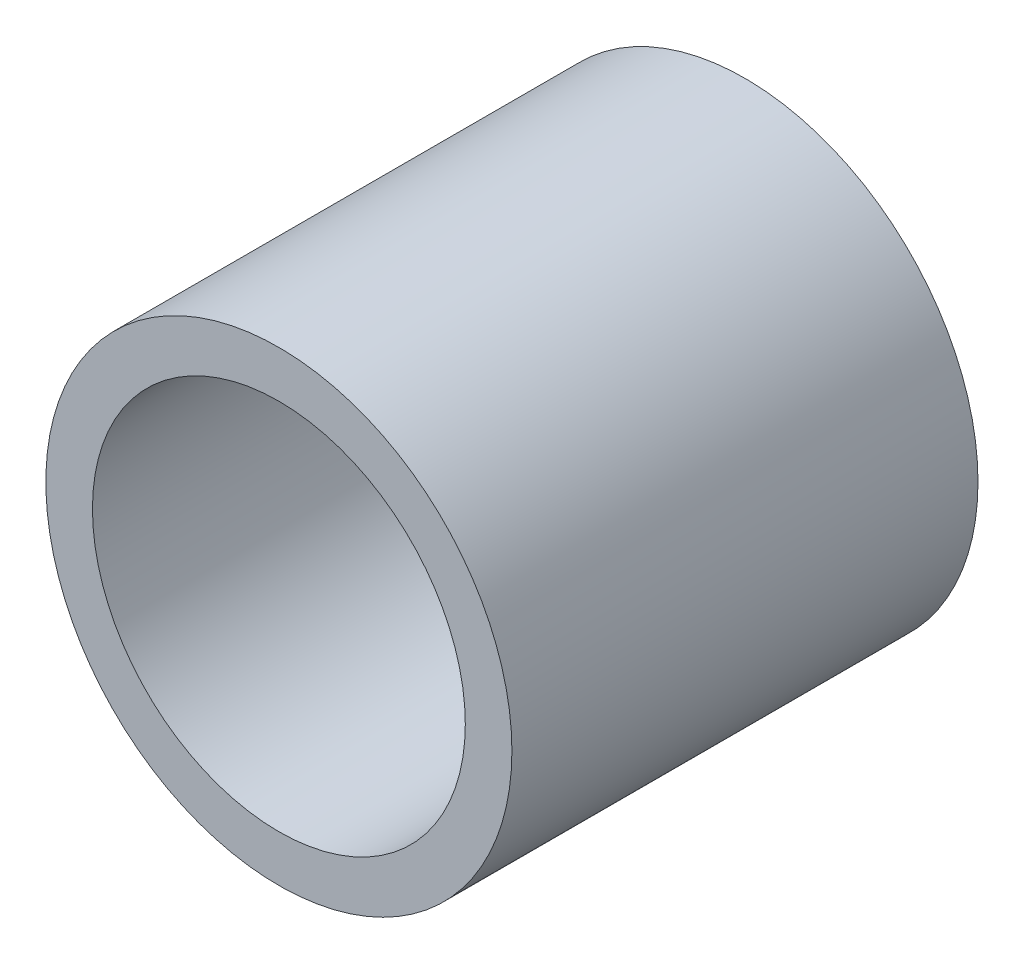
ISO-10303-21;
HEADER;
FILE_DESCRIPTION(('STEP AP214'),'2;1');
FILE_NAME('part.step','',(''),(''),'','','');
FILE_SCHEMA(('AUTOMOTIVE_DESIGN { 1 0 10303 214 1 1 1 1 }'));
ENDSEC;
DATA;
#1=APPLICATION_CONTEXT('core data for automotive mechanical design processes');
#2=APPLICATION_PROTOCOL_DEFINITION('international standard','automotive_design',2000,#1);
#3=PRODUCT_CONTEXT('',#1,'mechanical');
#4=PRODUCT('Part','Part','',(#3));
#5=PRODUCT_RELATED_PRODUCT_CATEGORY('part','',(#4));
#6=PRODUCT_DEFINITION_FORMATION('','',#4);
#7=PRODUCT_DEFINITION_CONTEXT('part definition',#1,'design');
#8=PRODUCT_DEFINITION('design','',#6,#7);
#9=PRODUCT_DEFINITION_SHAPE('','',#8);
#10=(LENGTH_UNIT() NAMED_UNIT(*) SI_UNIT(.MILLI.,.METRE.));
#11=(NAMED_UNIT(*) PLANE_ANGLE_UNIT() SI_UNIT($,.RADIAN.));
#12=(NAMED_UNIT(*) SI_UNIT($,.STERADIAN.) SOLID_ANGLE_UNIT());
#13=UNCERTAINTY_MEASURE_WITH_UNIT(LENGTH_MEASURE(1.E-05),#10,'distance_accuracy_value','');
#14=(GEOMETRIC_REPRESENTATION_CONTEXT(3) GLOBAL_UNCERTAINTY_ASSIGNED_CONTEXT((#13)) GLOBAL_UNIT_ASSIGNED_CONTEXT((#10,
#11,#12)) REPRESENTATION_CONTEXT('',''));
#15=CARTESIAN_POINT('',(0.,0.,0.));
#16=DIRECTION('',(0.,0.,1.));
#17=DIRECTION('',(1.,0.,0.));
#18=AXIS2_PLACEMENT_3D('',#15,#16,#17);
#19=CARTESIAN_POINT('',(0.,0.,18.));
#20=DIRECTION('',(0.,0.,1.));
#21=DIRECTION('',(1.,0.,0.));
#22=AXIS2_PLACEMENT_3D('',#19,#20,#21);
#23=PLANE('',#22);
#24=CARTESIAN_POINT('',(0.,0.,18.));
#25=DIRECTION('',(0.,0.,1.));
#26=DIRECTION('',(1.,0.,0.));
#27=AXIS2_PLACEMENT_3D('',#24,#25,#26);
#28=CIRCLE('',#27,5.);
#29=CARTESIAN_POINT('',(5.,0.,18.));
#30=VERTEX_POINT('',#29);
#31=EDGE_CURVE('E10',#30,#30,#28,.T.);
#32=ORIENTED_EDGE('',*,*,#31,.T.);
#33=EDGE_LOOP('',(#32));
#34=FACE_BOUND('',#33,.T.);
#35=CARTESIAN_POINT('',(0.,0.,18.));
#36=DIRECTION('',(0.,0.,1.));
#37=DIRECTION('',(1.,0.,0.));
#38=AXIS2_PLACEMENT_3D('',#35,#36,#37);
#39=CIRCLE('',#38,4.);
#40=CARTESIAN_POINT('',(4.,0.,18.));
#41=VERTEX_POINT('',#40);
#42=EDGE_CURVE('E52',#41,#41,#39,.T.);
#43=ORIENTED_EDGE('',*,*,#42,.F.);
#44=EDGE_LOOP('',(#43));
#45=FACE_BOUND('',#44,.T.);
#46=ADVANCED_FACE('F41',(#34,#45),#23,.T.);
#47=CARTESIAN_POINT('',(0.,0.,8.));
#48=DIRECTION('',(0.,0.,1.));
#49=DIRECTION('',(1.,0.,0.));
#50=AXIS2_PLACEMENT_3D('',#47,#48,#49);
#51=PLANE('',#50);
#52=CARTESIAN_POINT('',(0.,0.,8.));
#53=DIRECTION('',(0.,0.,1.));
#54=DIRECTION('',(1.,0.,0.));
#55=AXIS2_PLACEMENT_3D('',#52,#53,#54);
#56=CIRCLE('',#55,5.);
#57=CARTESIAN_POINT('',(5.,0.,8.));
#58=VERTEX_POINT('',#57);
#59=EDGE_CURVE('E45',#58,#58,#56,.T.);
#60=ORIENTED_EDGE('',*,*,#59,.F.);
#61=EDGE_LOOP('',(#60));
#62=FACE_BOUND('',#61,.T.);
#63=CARTESIAN_POINT('',(0.,0.,8.));
#64=DIRECTION('',(0.,0.,1.));
#65=DIRECTION('',(1.,0.,0.));
#66=AXIS2_PLACEMENT_3D('',#63,#64,#65);
#67=CIRCLE('',#66,4.);
#68=CARTESIAN_POINT('',(4.,0.,8.));
#69=VERTEX_POINT('',#68);
#70=EDGE_CURVE('E54',#69,#69,#67,.T.);
#71=ORIENTED_EDGE('',*,*,#70,.T.);
#72=EDGE_LOOP('',(#71));
#73=FACE_BOUND('',#72,.T.);
#74=ADVANCED_FACE('F64',(#62,#73),#51,.F.);
#75=CARTESIAN_POINT('',(0.,0.,18.));
#76=DIRECTION('',(0.,0.,-1.));
#77=DIRECTION('',(-1.,0.,0.));
#78=AXIS2_PLACEMENT_3D('',#75,#76,#77);
#79=CYLINDRICAL_SURFACE('',#78,5.);
#80=ORIENTED_EDGE('',*,*,#31,.F.);
#81=EDGE_LOOP('',(#80));
#82=FACE_BOUND('',#81,.T.);
#83=ORIENTED_EDGE('',*,*,#59,.T.);
#84=EDGE_LOOP('',(#83));
#85=FACE_BOUND('',#84,.T.);
#86=ADVANCED_FACE('F43',(#82,#85),#79,.T.);
#87=CARTESIAN_POINT('',(0.,0.,18.));
#88=DIRECTION('',(0.,0.,-1.));
#89=DIRECTION('',(-1.,0.,0.));
#90=AXIS2_PLACEMENT_3D('',#87,#88,#89);
#91=CYLINDRICAL_SURFACE('',#90,4.);
#92=ORIENTED_EDGE('',*,*,#42,.T.);
#93=EDGE_LOOP('',(#92));
#94=FACE_BOUND('',#93,.T.);
#95=ORIENTED_EDGE('',*,*,#70,.F.);
#96=EDGE_LOOP('',(#95));
#97=FACE_BOUND('',#96,.T.);
#98=ADVANCED_FACE('F60',(#94,#97),#91,.F.);
#99=CLOSED_SHELL('',(#46,#74,#86,#98));
#100=MANIFOLD_SOLID_BREP('B2',#99);
#101=ADVANCED_BREP_SHAPE_REPRESENTATION('',(#18,#100),#14);
#102=SHAPE_DEFINITION_REPRESENTATION(#9,#101);
ENDSEC;
END-ISO-10303-21;
